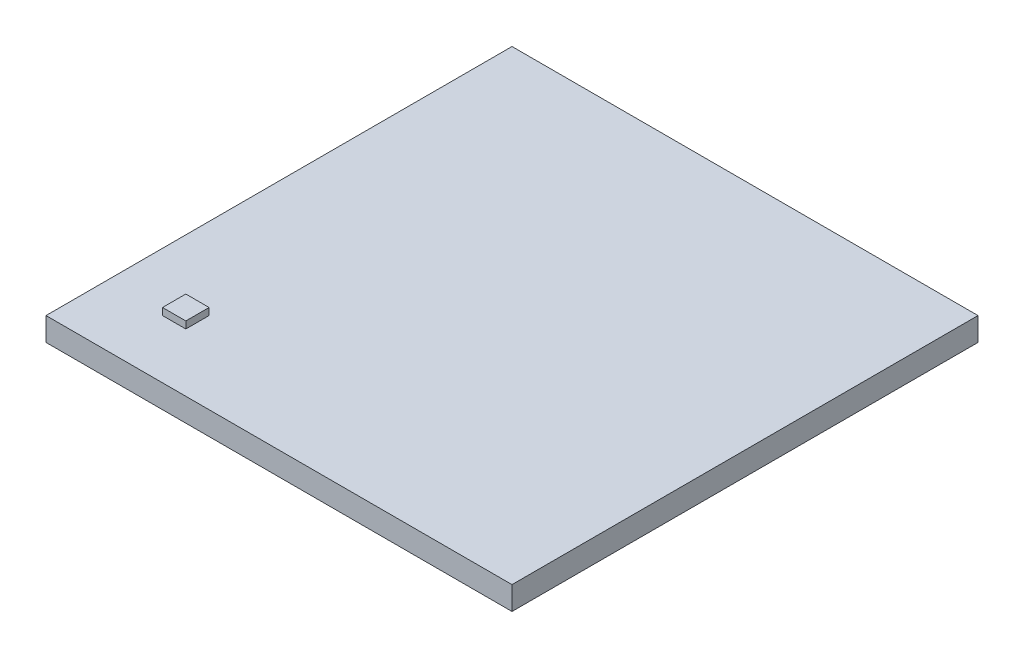
ISO-10303-21;
HEADER;
FILE_DESCRIPTION(('STEP AP214'),'2;1');
FILE_NAME('part.step','',(''),(''),'','','');
FILE_SCHEMA(('AUTOMOTIVE_DESIGN { 1 0 10303 214 1 1 1 1 }'));
ENDSEC;
DATA;
#1=APPLICATION_CONTEXT('core data for automotive mechanical design processes');
#2=APPLICATION_PROTOCOL_DEFINITION('international standard','automotive_design',2000,#1);
#3=PRODUCT_CONTEXT('',#1,'mechanical');
#4=PRODUCT('Part','Part','',(#3));
#5=PRODUCT_RELATED_PRODUCT_CATEGORY('part','',(#4));
#6=PRODUCT_DEFINITION_FORMATION('','',#4);
#7=PRODUCT_DEFINITION_CONTEXT('part definition',#1,'design');
#8=PRODUCT_DEFINITION('design','',#6,#7);
#9=PRODUCT_DEFINITION_SHAPE('','',#8);
#10=(LENGTH_UNIT() NAMED_UNIT(*) SI_UNIT(.MILLI.,.METRE.));
#11=(NAMED_UNIT(*) PLANE_ANGLE_UNIT() SI_UNIT($,.RADIAN.));
#12=(NAMED_UNIT(*) SI_UNIT($,.STERADIAN.) SOLID_ANGLE_UNIT());
#13=UNCERTAINTY_MEASURE_WITH_UNIT(LENGTH_MEASURE(1.E-05),#10,'distance_accuracy_value','');
#14=(GEOMETRIC_REPRESENTATION_CONTEXT(3) GLOBAL_UNCERTAINTY_ASSIGNED_CONTEXT((#13)) GLOBAL_UNIT_ASSIGNED_CONTEXT((#10,
#11,#12)) REPRESENTATION_CONTEXT('',''));
#15=CARTESIAN_POINT('',(0.,0.,0.));
#16=DIRECTION('',(0.,0.,1.));
#17=DIRECTION('',(1.,0.,0.));
#18=AXIS2_PLACEMENT_3D('',#15,#16,#17);
#19=CARTESIAN_POINT('',(-200.,-20.,-400.));
#20=DIRECTION('',(0.,0.,1.));
#21=DIRECTION('',(1.,0.,0.));
#22=AXIS2_PLACEMENT_3D('',#19,#20,#21);
#23=PLANE('',#22);
#24=DIRECTION('',(1.,0.,0.));
#25=VECTOR('',#24,1.);
#26=CARTESIAN_POINT('',(-200.,0.,-400.));
#27=LINE('',#26,#25);
#28=CARTESIAN_POINT('',(-200.,0.,-400.));
#29=VERTEX_POINT('',#28);
#30=CARTESIAN_POINT('',(200.,0.,-400.));
#31=VERTEX_POINT('',#30);
#32=EDGE_CURVE('E122',#29,#31,#27,.T.);
#33=ORIENTED_EDGE('',*,*,#32,.T.);
#34=DIRECTION('',(0.,1.,0.));
#35=VECTOR('',#34,1.);
#36=CARTESIAN_POINT('',(200.,-20.,-400.));
#37=LINE('',#36,#35);
#38=CARTESIAN_POINT('',(200.,-20.,-400.));
#39=VERTEX_POINT('',#38);
#40=EDGE_CURVE('E11',#39,#31,#37,.T.);
#41=ORIENTED_EDGE('',*,*,#40,.F.);
#42=DIRECTION('',(1.,0.,0.));
#43=VECTOR('',#42,1.);
#44=CARTESIAN_POINT('',(-200.,-20.,-400.));
#45=LINE('',#44,#43);
#46=CARTESIAN_POINT('',(-200.,-20.,-400.));
#47=VERTEX_POINT('',#46);
#48=EDGE_CURVE('E152',#47,#39,#45,.T.);
#49=ORIENTED_EDGE('',*,*,#48,.F.);
#50=DIRECTION('',(0.,1.,0.));
#51=VECTOR('',#50,1.);
#52=CARTESIAN_POINT('',(-200.,-20.,-400.));
#53=LINE('',#52,#51);
#54=EDGE_CURVE('E159',#47,#29,#53,.T.);
#55=ORIENTED_EDGE('',*,*,#54,.T.);
#56=EDGE_LOOP('',(#33,#41,#49,#55));
#57=FACE_BOUND('',#56,.T.);
#58=ADVANCED_FACE('F38',(#57),#23,.F.);
#59=CARTESIAN_POINT('',(200.,-20.,-400.));
#60=DIRECTION('',(-1.,0.,0.));
#61=DIRECTION('',(0.,0.,1.));
#62=AXIS2_PLACEMENT_3D('',#59,#60,#61);
#63=PLANE('',#62);
#64=DIRECTION('',(0.,0.,1.));
#65=VECTOR('',#64,1.);
#66=CARTESIAN_POINT('',(200.,0.,-400.));
#67=LINE('',#66,#65);
#68=CARTESIAN_POINT('',(200.,0.,0.));
#69=VERTEX_POINT('',#68);
#70=EDGE_CURVE('E162',#31,#69,#67,.T.);
#71=ORIENTED_EDGE('',*,*,#70,.T.);
#72=DIRECTION('',(0.,1.,0.));
#73=VECTOR('',#72,1.);
#74=CARTESIAN_POINT('',(200.,-20.,0.));
#75=LINE('',#74,#73);
#76=CARTESIAN_POINT('',(200.,-20.,0.));
#77=VERTEX_POINT('',#76);
#78=EDGE_CURVE('E45',#77,#69,#75,.T.);
#79=ORIENTED_EDGE('',*,*,#78,.F.);
#80=DIRECTION('',(0.,0.,1.));
#81=VECTOR('',#80,1.);
#82=CARTESIAN_POINT('',(200.,-20.,-400.));
#83=LINE('',#82,#81);
#84=EDGE_CURVE('E89',#39,#77,#83,.T.);
#85=ORIENTED_EDGE('',*,*,#84,.F.);
#86=ORIENTED_EDGE('',*,*,#40,.T.);
#87=EDGE_LOOP('',(#71,#79,#85,#86));
#88=FACE_BOUND('',#87,.T.);
#89=ADVANCED_FACE('F174',(#88),#63,.F.);
#90=CARTESIAN_POINT('',(0.,-20.,0.));
#91=DIRECTION('',(0.,0.,-1.));
#92=DIRECTION('',(-1.,0.,0.));
#93=AXIS2_PLACEMENT_3D('',#90,#91,#92);
#94=PLANE('',#93);
#95=DIRECTION('',(-1.,0.,0.));
#96=VECTOR('',#95,1.);
#97=CARTESIAN_POINT('',(0.,0.,0.));
#98=LINE('',#97,#96);
#99=CARTESIAN_POINT('',(-200.,0.,0.));
#100=VERTEX_POINT('',#99);
#101=EDGE_CURVE('E165',#69,#100,#98,.T.);
#102=ORIENTED_EDGE('',*,*,#101,.T.);
#103=DIRECTION('',(0.,1.,0.));
#104=VECTOR('',#103,1.);
#105=CARTESIAN_POINT('',(-200.,-20.,0.));
#106=LINE('',#105,#104);
#107=CARTESIAN_POINT('',(-200.,-20.,0.));
#108=VERTEX_POINT('',#107);
#109=EDGE_CURVE('E169',#108,#100,#106,.T.);
#110=ORIENTED_EDGE('',*,*,#109,.F.);
#111=DIRECTION('',(1.,0.,0.));
#112=VECTOR('',#111,1.);
#113=CARTESIAN_POINT('',(0.,-20.,0.));
#114=LINE('',#113,#112);
#115=EDGE_CURVE('E155',#108,#77,#114,.T.);
#116=ORIENTED_EDGE('',*,*,#115,.T.);
#117=ORIENTED_EDGE('',*,*,#78,.T.);
#118=EDGE_LOOP('',(#102,#110,#116,#117));
#119=FACE_BOUND('',#118,.T.);
#120=ADVANCED_FACE('F172',(#119),#94,.F.);
#121=CARTESIAN_POINT('',(-200.,-20.,0.));
#122=DIRECTION('',(1.,0.,0.));
#123=DIRECTION('',(0.,0.,-1.));
#124=AXIS2_PLACEMENT_3D('',#121,#122,#123);
#125=PLANE('',#124);
#126=DIRECTION('',(0.,0.,-1.));
#127=VECTOR('',#126,1.);
#128=CARTESIAN_POINT('',(-200.,0.,0.));
#129=LINE('',#128,#127);
#130=EDGE_CURVE('E82',#100,#29,#129,.T.);
#131=ORIENTED_EDGE('',*,*,#130,.T.);
#132=ORIENTED_EDGE('',*,*,#54,.F.);
#133=DIRECTION('',(0.,0.,-1.));
#134=VECTOR('',#133,1.);
#135=CARTESIAN_POINT('',(-200.,-20.,0.));
#136=LINE('',#135,#134);
#137=EDGE_CURVE('E61',#108,#47,#136,.T.);
#138=ORIENTED_EDGE('',*,*,#137,.F.);
#139=ORIENTED_EDGE('',*,*,#109,.T.);
#140=EDGE_LOOP('',(#131,#132,#138,#139));
#141=FACE_BOUND('',#140,.T.);
#142=ADVANCED_FACE('F181',(#141),#125,.F.);
#143=CARTESIAN_POINT('',(0.,-20.,0.));
#144=DIRECTION('',(0.,-1.,0.));
#145=DIRECTION('',(0.,0.,-1.));
#146=AXIS2_PLACEMENT_3D('',#143,#144,#145);
#147=PLANE('',#146);
#148=ORIENTED_EDGE('',*,*,#48,.T.);
#149=ORIENTED_EDGE('',*,*,#84,.T.);
#150=ORIENTED_EDGE('',*,*,#115,.F.);
#151=ORIENTED_EDGE('',*,*,#137,.T.);
#152=EDGE_LOOP('',(#148,#149,#150,#151));
#153=FACE_BOUND('',#152,.T.);
#154=ADVANCED_FACE('F183',(#153),#147,.T.);
#155=CARTESIAN_POINT('',(0.,0.,0.));
#156=DIRECTION('',(0.,-1.,0.));
#157=DIRECTION('',(0.,0.,-1.));
#158=AXIS2_PLACEMENT_3D('',#155,#156,#157);
#159=PLANE('',#158);
#160=DIRECTION('',(1.,0.,0.));
#161=VECTOR('',#160,1.);
#162=CARTESIAN_POINT('',(0.,0.,-70.));
#163=LINE('',#162,#161);
#164=CARTESIAN_POINT('',(-150.,0.,-70.));
#165=VERTEX_POINT('',#164);
#166=CARTESIAN_POINT('',(-130.,0.,-70.));
#167=VERTEX_POINT('',#166);
#168=EDGE_CURVE('E143',#165,#167,#163,.T.);
#169=ORIENTED_EDGE('',*,*,#168,.T.);
#170=DIRECTION('',(0.,0.,1.));
#171=VECTOR('',#170,1.);
#172=CARTESIAN_POINT('',(-130.,0.,0.));
#173=LINE('',#172,#171);
#174=CARTESIAN_POINT('',(-130.,0.,-50.));
#175=VERTEX_POINT('',#174);
#176=EDGE_CURVE('E117',#167,#175,#173,.T.);
#177=ORIENTED_EDGE('',*,*,#176,.T.);
#178=DIRECTION('',(-1.,0.,0.));
#179=VECTOR('',#178,1.);
#180=CARTESIAN_POINT('',(0.,0.,-50.));
#181=LINE('',#180,#179);
#182=CARTESIAN_POINT('',(-150.,0.,-50.));
#183=VERTEX_POINT('',#182);
#184=EDGE_CURVE('E133',#175,#183,#181,.T.);
#185=ORIENTED_EDGE('',*,*,#184,.T.);
#186=DIRECTION('',(0.,0.,-1.));
#187=VECTOR('',#186,1.);
#188=CARTESIAN_POINT('',(-150.,0.,0.));
#189=LINE('',#188,#187);
#190=EDGE_CURVE('E52',#183,#165,#189,.T.);
#191=ORIENTED_EDGE('',*,*,#190,.T.);
#192=EDGE_LOOP('',(#169,#177,#185,#191));
#193=FACE_BOUND('',#192,.T.);
#194=ORIENTED_EDGE('',*,*,#32,.F.);
#195=ORIENTED_EDGE('',*,*,#130,.F.);
#196=ORIENTED_EDGE('',*,*,#101,.F.);
#197=ORIENTED_EDGE('',*,*,#70,.F.);
#198=EDGE_LOOP('',(#194,#195,#196,#197));
#199=FACE_BOUND('',#198,.T.);
#200=ADVANCED_FACE('F178',(#193,#199),#159,.F.);
#201=CARTESIAN_POINT('',(-130.,6.,0.));
#202=DIRECTION('',(1.,0.,0.));
#203=DIRECTION('',(0.,0.,-1.));
#204=AXIS2_PLACEMENT_3D('',#201,#202,#203);
#205=PLANE('',#204);
#206=ORIENTED_EDGE('',*,*,#176,.F.);
#207=DIRECTION('',(0.,-1.,0.));
#208=VECTOR('',#207,1.);
#209=CARTESIAN_POINT('',(-130.,6.,-70.));
#210=LINE('',#209,#208);
#211=CARTESIAN_POINT('',(-130.,6.,-70.));
#212=VERTEX_POINT('',#211);
#213=EDGE_CURVE('E111',#212,#167,#210,.T.);
#214=ORIENTED_EDGE('',*,*,#213,.F.);
#215=DIRECTION('',(0.,0.,1.));
#216=VECTOR('',#215,1.);
#217=CARTESIAN_POINT('',(-130.,6.,0.));
#218=LINE('',#217,#216);
#219=CARTESIAN_POINT('',(-130.,6.,-50.));
#220=VERTEX_POINT('',#219);
#221=EDGE_CURVE('E114',#212,#220,#218,.T.);
#222=ORIENTED_EDGE('',*,*,#221,.T.);
#223=DIRECTION('',(0.,-1.,0.));
#224=VECTOR('',#223,1.);
#225=CARTESIAN_POINT('',(-130.,6.,-50.));
#226=LINE('',#225,#224);
#227=EDGE_CURVE('E141',#220,#175,#226,.T.);
#228=ORIENTED_EDGE('',*,*,#227,.T.);
#229=EDGE_LOOP('',(#206,#214,#222,#228));
#230=FACE_BOUND('',#229,.T.);
#231=ADVANCED_FACE('F113',(#230),#205,.T.);
#232=CARTESIAN_POINT('',(0.,6.,-70.));
#233=DIRECTION('',(0.,0.,-1.));
#234=DIRECTION('',(-1.,0.,0.));
#235=AXIS2_PLACEMENT_3D('',#232,#233,#234);
#236=PLANE('',#235);
#237=ORIENTED_EDGE('',*,*,#168,.F.);
#238=DIRECTION('',(0.,-1.,0.));
#239=VECTOR('',#238,1.);
#240=CARTESIAN_POINT('',(-150.,6.,-70.));
#241=LINE('',#240,#239);
#242=CARTESIAN_POINT('',(-150.,6.,-70.));
#243=VERTEX_POINT('',#242);
#244=EDGE_CURVE('E123',#243,#165,#241,.T.);
#245=ORIENTED_EDGE('',*,*,#244,.F.);
#246=DIRECTION('',(1.,0.,0.));
#247=VECTOR('',#246,1.);
#248=CARTESIAN_POINT('',(0.,6.,-70.));
#249=LINE('',#248,#247);
#250=EDGE_CURVE('E129',#243,#212,#249,.T.);
#251=ORIENTED_EDGE('',*,*,#250,.T.);
#252=ORIENTED_EDGE('',*,*,#213,.T.);
#253=EDGE_LOOP('',(#237,#245,#251,#252));
#254=FACE_BOUND('',#253,.T.);
#255=ADVANCED_FACE('F135',(#254),#236,.T.);
#256=CARTESIAN_POINT('',(-150.,6.,0.));
#257=DIRECTION('',(-1.,0.,0.));
#258=DIRECTION('',(0.,0.,1.));
#259=AXIS2_PLACEMENT_3D('',#256,#257,#258);
#260=PLANE('',#259);
#261=ORIENTED_EDGE('',*,*,#190,.F.);
#262=DIRECTION('',(0.,-1.,0.));
#263=VECTOR('',#262,1.);
#264=CARTESIAN_POINT('',(-150.,6.,-50.));
#265=LINE('',#264,#263);
#266=CARTESIAN_POINT('',(-150.,6.,-50.));
#267=VERTEX_POINT('',#266);
#268=EDGE_CURVE('E149',#267,#183,#265,.T.);
#269=ORIENTED_EDGE('',*,*,#268,.F.);
#270=DIRECTION('',(0.,0.,-1.));
#271=VECTOR('',#270,1.);
#272=CARTESIAN_POINT('',(-150.,6.,0.));
#273=LINE('',#272,#271);
#274=EDGE_CURVE('E136',#267,#243,#273,.T.);
#275=ORIENTED_EDGE('',*,*,#274,.T.);
#276=ORIENTED_EDGE('',*,*,#244,.T.);
#277=EDGE_LOOP('',(#261,#269,#275,#276));
#278=FACE_BOUND('',#277,.T.);
#279=ADVANCED_FACE('F238',(#278),#260,.T.);
#280=CARTESIAN_POINT('',(0.,6.,-50.));
#281=DIRECTION('',(0.,0.,1.));
#282=DIRECTION('',(1.,0.,0.));
#283=AXIS2_PLACEMENT_3D('',#280,#281,#282);
#284=PLANE('',#283);
#285=ORIENTED_EDGE('',*,*,#184,.F.);
#286=ORIENTED_EDGE('',*,*,#227,.F.);
#287=DIRECTION('',(-1.,0.,0.));
#288=VECTOR('',#287,1.);
#289=CARTESIAN_POINT('',(0.,6.,-50.));
#290=LINE('',#289,#288);
#291=EDGE_CURVE('E132',#220,#267,#290,.T.);
#292=ORIENTED_EDGE('',*,*,#291,.T.);
#293=ORIENTED_EDGE('',*,*,#268,.T.);
#294=EDGE_LOOP('',(#285,#286,#292,#293));
#295=FACE_BOUND('',#294,.T.);
#296=ADVANCED_FACE('F247',(#295),#284,.T.);
#297=CARTESIAN_POINT('',(0.,6.,0.));
#298=DIRECTION('',(0.,1.,0.));
#299=DIRECTION('',(0.,0.,1.));
#300=AXIS2_PLACEMENT_3D('',#297,#298,#299);
#301=PLANE('',#300);
#302=ORIENTED_EDGE('',*,*,#221,.F.);
#303=ORIENTED_EDGE('',*,*,#250,.F.);
#304=ORIENTED_EDGE('',*,*,#274,.F.);
#305=ORIENTED_EDGE('',*,*,#291,.F.);
#306=EDGE_LOOP('',(#302,#303,#304,#305));
#307=FACE_BOUND('',#306,.T.);
#308=ADVANCED_FACE('F127',(#307),#301,.T.);
#309=CLOSED_SHELL('',(#58,#89,#120,#142,#154,#200,#231,#255,#279,#296,#308));
#310=MANIFOLD_SOLID_BREP('B2',#309);
#311=ADVANCED_BREP_SHAPE_REPRESENTATION('',(#18,#310),#14);
#312=SHAPE_DEFINITION_REPRESENTATION(#9,#311);
ENDSEC;
END-ISO-10303-21;
